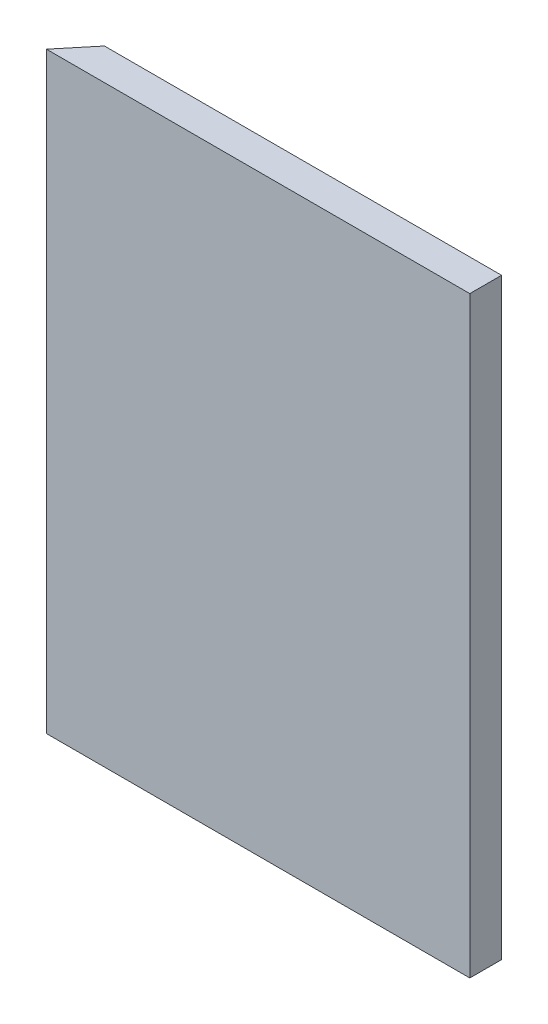
ISO-10303-21;
HEADER;
FILE_DESCRIPTION(('STEP AP214'),'2;1');
FILE_NAME('part.step','',(''),(''),'','','');
FILE_SCHEMA(('AUTOMOTIVE_DESIGN { 1 0 10303 214 1 1 1 1 }'));
ENDSEC;
DATA;
#1=APPLICATION_CONTEXT('core data for automotive mechanical design processes');
#2=APPLICATION_PROTOCOL_DEFINITION('international standard','automotive_design',2000,#1);
#3=PRODUCT_CONTEXT('',#1,'mechanical');
#4=PRODUCT('Part','Part','',(#3));
#5=PRODUCT_RELATED_PRODUCT_CATEGORY('part','',(#4));
#6=PRODUCT_DEFINITION_FORMATION('','',#4);
#7=PRODUCT_DEFINITION_CONTEXT('part definition',#1,'design');
#8=PRODUCT_DEFINITION('design','',#6,#7);
#9=PRODUCT_DEFINITION_SHAPE('','',#8);
#10=(LENGTH_UNIT() NAMED_UNIT(*) SI_UNIT(.MILLI.,.METRE.));
#11=(NAMED_UNIT(*) PLANE_ANGLE_UNIT() SI_UNIT($,.RADIAN.));
#12=(NAMED_UNIT(*) SI_UNIT($,.STERADIAN.) SOLID_ANGLE_UNIT());
#13=UNCERTAINTY_MEASURE_WITH_UNIT(LENGTH_MEASURE(1.E-05),#10,'distance_accuracy_value','');
#14=(GEOMETRIC_REPRESENTATION_CONTEXT(3) GLOBAL_UNCERTAINTY_ASSIGNED_CONTEXT((#13)) GLOBAL_UNIT_ASSIGNED_CONTEXT((#10,
#11,#12)) REPRESENTATION_CONTEXT('',''));
#15=CARTESIAN_POINT('',(0.,0.,0.));
#16=DIRECTION('',(0.,0.,1.));
#17=DIRECTION('',(1.,0.,0.));
#18=AXIS2_PLACEMENT_3D('',#15,#16,#17);
#19=CARTESIAN_POINT('',(-6.5,14.,0.5));
#20=DIRECTION('',(0.,0.,-1.));
#21=DIRECTION('',(-1.,0.,0.));
#22=AXIS2_PLACEMENT_3D('',#19,#20,#21);
#23=PLANE('',#22);
#24=DIRECTION('',(1.,0.,0.));
#25=VECTOR('',#24,1.);
#26=CARTESIAN_POINT('',(-6.5,0.,0.5));
#27=LINE('',#26,#25);
#28=CARTESIAN_POINT('',(-6.5,0.,0.5));
#29=VERTEX_POINT('',#28);
#30=CARTESIAN_POINT('',(3.5,0.,0.5));
#31=VERTEX_POINT('',#30);
#32=EDGE_CURVE('E86',#29,#31,#27,.T.);
#33=ORIENTED_EDGE('',*,*,#32,.T.);
#34=DIRECTION('',(0.,-1.,0.));
#35=VECTOR('',#34,1.);
#36=CARTESIAN_POINT('',(3.5,14.,0.5));
#37=LINE('',#36,#35);
#38=CARTESIAN_POINT('',(3.5,14.,0.5));
#39=VERTEX_POINT('',#38);
#40=EDGE_CURVE('E47',#39,#31,#37,.T.);
#41=ORIENTED_EDGE('',*,*,#40,.F.);
#42=DIRECTION('',(1.,0.,0.));
#43=VECTOR('',#42,1.);
#44=CARTESIAN_POINT('',(-6.5,14.,0.5));
#45=LINE('',#44,#43);
#46=CARTESIAN_POINT('',(-6.5,14.,0.5));
#47=VERTEX_POINT('',#46);
#48=EDGE_CURVE('E95',#47,#39,#45,.T.);
#49=ORIENTED_EDGE('',*,*,#48,.F.);
#50=DIRECTION('',(0.,-1.,0.));
#51=VECTOR('',#50,1.);
#52=CARTESIAN_POINT('',(-6.5,14.,0.5));
#53=LINE('',#52,#51);
#54=EDGE_CURVE('E11',#47,#29,#53,.T.);
#55=ORIENTED_EDGE('',*,*,#54,.T.);
#56=EDGE_LOOP('',(#33,#41,#49,#55));
#57=FACE_BOUND('',#56,.T.);
#58=ADVANCED_FACE('F40',(#57),#23,.F.);
#59=CARTESIAN_POINT('',(3.5,14.,-0.25));
#60=DIRECTION('',(-1.,0.,0.));
#61=DIRECTION('',(0.,0.,1.));
#62=AXIS2_PLACEMENT_3D('',#59,#60,#61);
#63=PLANE('',#62);
#64=DIRECTION('',(0.,0.,-1.));
#65=VECTOR('',#64,1.);
#66=CARTESIAN_POINT('',(3.5,0.,-0.25));
#67=LINE('',#66,#65);
#68=CARTESIAN_POINT('',(3.5,0.,-0.25));
#69=VERTEX_POINT('',#68);
#70=EDGE_CURVE('E76',#31,#69,#67,.T.);
#71=ORIENTED_EDGE('',*,*,#70,.T.);
#72=DIRECTION('',(0.,-1.,0.));
#73=VECTOR('',#72,1.);
#74=CARTESIAN_POINT('',(3.5,14.,-0.25));
#75=LINE('',#74,#73);
#76=CARTESIAN_POINT('',(3.5,14.,-0.25));
#77=VERTEX_POINT('',#76);
#78=EDGE_CURVE('E79',#77,#69,#75,.T.);
#79=ORIENTED_EDGE('',*,*,#78,.F.);
#80=DIRECTION('',(0.,0.,-1.));
#81=VECTOR('',#80,1.);
#82=CARTESIAN_POINT('',(3.5,14.,-0.25));
#83=LINE('',#82,#81);
#84=EDGE_CURVE('E63',#39,#77,#83,.T.);
#85=ORIENTED_EDGE('',*,*,#84,.F.);
#86=ORIENTED_EDGE('',*,*,#40,.T.);
#87=EDGE_LOOP('',(#71,#79,#85,#86));
#88=FACE_BOUND('',#87,.T.);
#89=ADVANCED_FACE('F78',(#88),#63,.F.);
#90=CARTESIAN_POINT('',(-6.5,14.,-0.25));
#91=DIRECTION('',(0.,0.,1.));
#92=DIRECTION('',(1.,0.,0.));
#93=AXIS2_PLACEMENT_3D('',#90,#91,#92);
#94=PLANE('',#93);
#95=DIRECTION('',(-1.,0.,0.));
#96=VECTOR('',#95,1.);
#97=CARTESIAN_POINT('',(-6.5,0.,-0.25));
#98=LINE('',#97,#96);
#99=CARTESIAN_POINT('',(-5.87969726538419,0.,-0.250000000000001));
#100=VERTEX_POINT('',#99);
#101=EDGE_CURVE('E85',#69,#100,#98,.T.);
#102=ORIENTED_EDGE('',*,*,#101,.T.);
#103=DIRECTION('',(0.,1.,0.));
#104=VECTOR('',#103,1.);
#105=CARTESIAN_POINT('',(-5.8796972653842,0.,-0.25));
#106=LINE('',#105,#104);
#107=CARTESIAN_POINT('',(-5.8796972653842,14.,-0.25));
#108=VERTEX_POINT('',#107);
#109=EDGE_CURVE('E54',#100,#108,#106,.T.);
#110=ORIENTED_EDGE('',*,*,#109,.T.);
#111=DIRECTION('',(-1.,0.,0.));
#112=VECTOR('',#111,1.);
#113=CARTESIAN_POINT('',(-6.5,14.,-0.25));
#114=LINE('',#113,#112);
#115=EDGE_CURVE('E91',#77,#108,#114,.T.);
#116=ORIENTED_EDGE('',*,*,#115,.F.);
#117=ORIENTED_EDGE('',*,*,#78,.T.);
#118=EDGE_LOOP('',(#102,#110,#116,#117));
#119=FACE_BOUND('',#118,.T.);
#120=ADVANCED_FACE('F90',(#119),#94,.F.);
#121=CARTESIAN_POINT('',(0.,14.,0.));
#122=DIRECTION('',(0.,1.,0.));
#123=DIRECTION('',(0.,0.,1.));
#124=AXIS2_PLACEMENT_3D('',#121,#122,#123);
#125=PLANE('',#124);
#126=DIRECTION('',(0.637331739664045,0.,-0.770589549382031));
#127=VECTOR('',#126,1.);
#128=CARTESIAN_POINT('',(-6.5,14.,0.5));
#129=LINE('',#128,#127);
#130=EDGE_CURVE('E103',#47,#108,#129,.T.);
#131=ORIENTED_EDGE('',*,*,#130,.F.);
#132=ORIENTED_EDGE('',*,*,#48,.T.);
#133=ORIENTED_EDGE('',*,*,#84,.T.);
#134=ORIENTED_EDGE('',*,*,#115,.T.);
#135=EDGE_LOOP('',(#131,#132,#133,#134));
#136=FACE_BOUND('',#135,.T.);
#137=ADVANCED_FACE('F111',(#136),#125,.T.);
#138=CARTESIAN_POINT('',(0.,0.,0.));
#139=DIRECTION('',(0.,1.,0.));
#140=DIRECTION('',(0.,0.,1.));
#141=AXIS2_PLACEMENT_3D('',#138,#139,#140);
#142=PLANE('',#141);
#143=ORIENTED_EDGE('',*,*,#32,.F.);
#144=DIRECTION('',(0.637331739664045,0.,-0.770589549382031));
#145=VECTOR('',#144,1.);
#146=CARTESIAN_POINT('',(-6.5,0.,0.5));
#147=LINE('',#146,#145);
#148=EDGE_CURVE('E94',#29,#100,#147,.T.);
#149=ORIENTED_EDGE('',*,*,#148,.T.);
#150=ORIENTED_EDGE('',*,*,#101,.F.);
#151=ORIENTED_EDGE('',*,*,#70,.F.);
#152=EDGE_LOOP('',(#143,#149,#150,#151));
#153=FACE_BOUND('',#152,.T.);
#154=ADVANCED_FACE('F93',(#153),#142,.F.);
#155=CARTESIAN_POINT('',(-6.5,0.,0.5));
#156=DIRECTION('',(0.770589549382031,0.,0.637331739664045));
#157=DIRECTION('',(0.637331739664045,0.,-0.770589549382031));
#158=AXIS2_PLACEMENT_3D('',#155,#156,#157);
#159=PLANE('',#158);
#160=ORIENTED_EDGE('',*,*,#130,.T.);
#161=ORIENTED_EDGE('',*,*,#109,.F.);
#162=ORIENTED_EDGE('',*,*,#148,.F.);
#163=ORIENTED_EDGE('',*,*,#54,.F.);
#164=EDGE_LOOP('',(#160,#161,#162,#163));
#165=FACE_BOUND('',#164,.T.);
#166=ADVANCED_FACE('F108',(#165),#159,.F.);
#167=CLOSED_SHELL('',(#58,#89,#120,#137,#154,#166));
#168=MANIFOLD_SOLID_BREP('B2',#167);
#169=ADVANCED_BREP_SHAPE_REPRESENTATION('',(#18,#168),#14);
#170=SHAPE_DEFINITION_REPRESENTATION(#9,#169);
ENDSEC;
END-ISO-10303-21;
